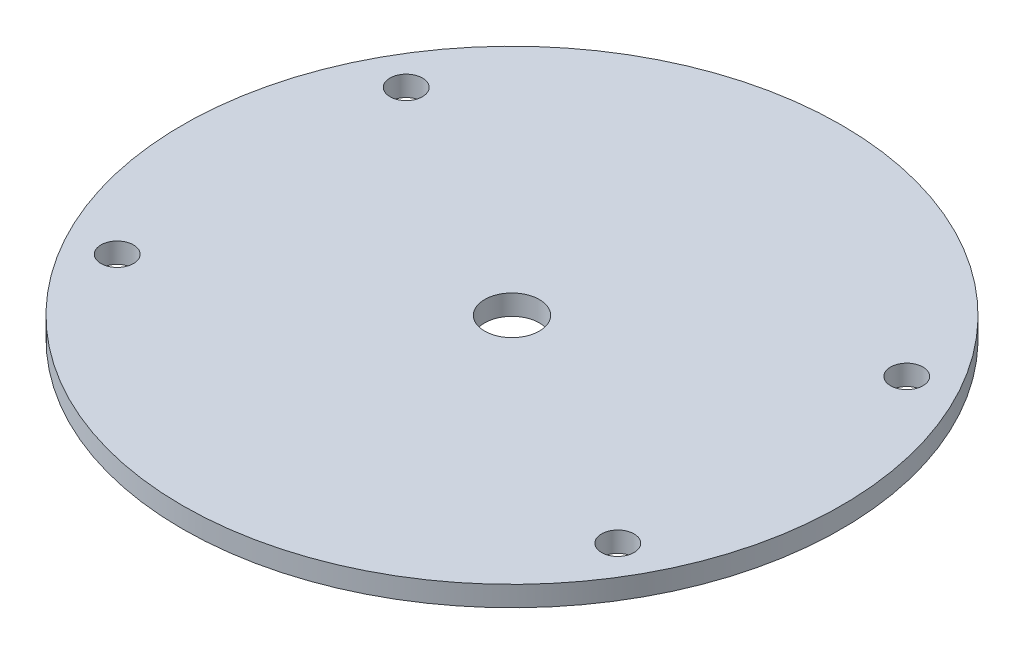
ISO-10303-21;
HEADER;
FILE_DESCRIPTION(('STEP AP214'),'2;1');
FILE_NAME('part.step','',(''),(''),'','','');
FILE_SCHEMA(('AUTOMOTIVE_DESIGN { 1 0 10303 214 1 1 1 1 }'));
ENDSEC;
DATA;
#1=APPLICATION_CONTEXT('core data for automotive mechanical design processes');
#2=APPLICATION_PROTOCOL_DEFINITION('international standard','automotive_design',2000,#1);
#3=PRODUCT_CONTEXT('',#1,'mechanical');
#4=PRODUCT('Part','Part','',(#3));
#5=PRODUCT_RELATED_PRODUCT_CATEGORY('part','',(#4));
#6=PRODUCT_DEFINITION_FORMATION('','',#4);
#7=PRODUCT_DEFINITION_CONTEXT('part definition',#1,'design');
#8=PRODUCT_DEFINITION('design','',#6,#7);
#9=PRODUCT_DEFINITION_SHAPE('','',#8);
#10=(LENGTH_UNIT() NAMED_UNIT(*) SI_UNIT(.MILLI.,.METRE.));
#11=(NAMED_UNIT(*) PLANE_ANGLE_UNIT() SI_UNIT($,.RADIAN.));
#12=(NAMED_UNIT(*) SI_UNIT($,.STERADIAN.) SOLID_ANGLE_UNIT());
#13=UNCERTAINTY_MEASURE_WITH_UNIT(LENGTH_MEASURE(1.E-05),#10,'distance_accuracy_value','');
#14=(GEOMETRIC_REPRESENTATION_CONTEXT(3) GLOBAL_UNCERTAINTY_ASSIGNED_CONTEXT((#13)) GLOBAL_UNIT_ASSIGNED_CONTEXT((#10,
#11,#12)) REPRESENTATION_CONTEXT('',''));
#15=CARTESIAN_POINT('',(0.,0.,0.));
#16=DIRECTION('',(0.,0.,1.));
#17=DIRECTION('',(1.,0.,0.));
#18=AXIS2_PLACEMENT_3D('',#15,#16,#17);
#19=CARTESIAN_POINT('',(0.,2.,0.));
#20=DIRECTION('',(0.,1.,0.));
#21=DIRECTION('',(0.,0.,1.));
#22=AXIS2_PLACEMENT_3D('',#19,#20,#21);
#23=PLANE('',#22);
#24=CARTESIAN_POINT('',(0.,2.,0.));
#25=DIRECTION('',(0.,1.,0.));
#26=DIRECTION('',(0.,0.,1.));
#27=AXIS2_PLACEMENT_3D('',#24,#25,#26);
#28=CIRCLE('',#27,2.7);
#29=CARTESIAN_POINT('',(0.,2.,2.7));
#30=VERTEX_POINT('',#29);
#31=EDGE_CURVE('E63',#30,#30,#28,.T.);
#32=ORIENTED_EDGE('',*,*,#31,.F.);
#33=EDGE_LOOP('',(#32));
#34=FACE_BOUND('',#33,.T.);
#35=CARTESIAN_POINT('',(24.6817240078565,2.,-14.25));
#36=DIRECTION('',(0.,1.,0.));
#37=DIRECTION('',(0.,0.,-1.));
#38=AXIS2_PLACEMENT_3D('',#35,#36,#37);
#39=CIRCLE('',#38,1.6);
#40=CARTESIAN_POINT('',(24.6817240078565,2.,-15.85));
#41=VERTEX_POINT('',#40);
#42=EDGE_CURVE('E51',#41,#41,#39,.T.);
#43=ORIENTED_EDGE('',*,*,#42,.F.);
#44=EDGE_LOOP('',(#43));
#45=FACE_BOUND('',#44,.T.);
#46=CARTESIAN_POINT('',(0.,2.,0.));
#47=DIRECTION('',(0.,1.,0.));
#48=DIRECTION('',(0.,0.,1.));
#49=AXIS2_PLACEMENT_3D('',#46,#47,#48);
#50=CIRCLE('',#49,32.5);
#51=CARTESIAN_POINT('',(0.,2.,32.5));
#52=VERTEX_POINT('',#51);
#53=EDGE_CURVE('E10',#52,#52,#50,.T.);
#54=ORIENTED_EDGE('',*,*,#53,.T.);
#55=EDGE_LOOP('',(#54));
#56=FACE_BOUND('',#55,.T.);
#57=CARTESIAN_POINT('',(-24.6817240078565,2.,14.25));
#58=DIRECTION('',(0.,1.,0.));
#59=DIRECTION('',(0.,0.,-1.));
#60=AXIS2_PLACEMENT_3D('',#57,#58,#59);
#61=CIRCLE('',#60,1.6);
#62=CARTESIAN_POINT('',(-24.6817240078565,2.,12.65));
#63=VERTEX_POINT('',#62);
#64=EDGE_CURVE('E46',#63,#63,#61,.T.);
#65=ORIENTED_EDGE('',*,*,#64,.F.);
#66=EDGE_LOOP('',(#65));
#67=FACE_BOUND('',#66,.T.);
#68=CARTESIAN_POINT('',(-24.6817240078565,2.,-14.25));
#69=DIRECTION('',(0.,1.,0.));
#70=DIRECTION('',(0.,0.,1.));
#71=AXIS2_PLACEMENT_3D('',#68,#69,#70);
#72=CIRCLE('',#71,1.6);
#73=CARTESIAN_POINT('',(-24.6817240078565,2.,-12.65));
#74=VERTEX_POINT('',#73);
#75=EDGE_CURVE('E57',#74,#74,#72,.T.);
#76=ORIENTED_EDGE('',*,*,#75,.F.);
#77=EDGE_LOOP('',(#76));
#78=FACE_BOUND('',#77,.T.);
#79=CARTESIAN_POINT('',(24.6817240078565,2.,14.25));
#80=DIRECTION('',(0.,1.,0.));
#81=DIRECTION('',(0.,0.,1.));
#82=AXIS2_PLACEMENT_3D('',#79,#80,#81);
#83=CIRCLE('',#82,1.6);
#84=CARTESIAN_POINT('',(24.6817240078565,2.,15.85));
#85=VERTEX_POINT('',#84);
#86=EDGE_CURVE('E69',#85,#85,#83,.T.);
#87=ORIENTED_EDGE('',*,*,#86,.F.);
#88=EDGE_LOOP('',(#87));
#89=FACE_BOUND('',#88,.T.);
#90=ADVANCED_FACE('F35',(#34,#45,#56,#67,#78,#89),#23,.T.);
#91=CARTESIAN_POINT('',(0.,0.,0.));
#92=DIRECTION('',(0.,1.,0.));
#93=DIRECTION('',(0.,0.,1.));
#94=AXIS2_PLACEMENT_3D('',#91,#92,#93);
#95=PLANE('',#94);
#96=CARTESIAN_POINT('',(0.,0.,0.));
#97=DIRECTION('',(0.,1.,0.));
#98=DIRECTION('',(0.,0.,1.));
#99=AXIS2_PLACEMENT_3D('',#96,#97,#98);
#100=CIRCLE('',#99,32.5);
#101=CARTESIAN_POINT('',(0.,0.,32.5));
#102=VERTEX_POINT('',#101);
#103=EDGE_CURVE('E39',#102,#102,#100,.T.);
#104=ORIENTED_EDGE('',*,*,#103,.F.);
#105=EDGE_LOOP('',(#104));
#106=FACE_BOUND('',#105,.T.);
#107=CARTESIAN_POINT('',(-24.6817240078565,0.,14.25));
#108=DIRECTION('',(0.,1.,0.));
#109=DIRECTION('',(0.,0.,-1.));
#110=AXIS2_PLACEMENT_3D('',#107,#108,#109);
#111=CIRCLE('',#110,1.6);
#112=CARTESIAN_POINT('',(-24.6817240078565,0.,12.65));
#113=VERTEX_POINT('',#112);
#114=EDGE_CURVE('E48',#113,#113,#111,.T.);
#115=ORIENTED_EDGE('',*,*,#114,.T.);
#116=EDGE_LOOP('',(#115));
#117=FACE_BOUND('',#116,.T.);
#118=CARTESIAN_POINT('',(24.6817240078565,0.,-14.25));
#119=DIRECTION('',(0.,1.,0.));
#120=DIRECTION('',(0.,0.,-1.));
#121=AXIS2_PLACEMENT_3D('',#118,#119,#120);
#122=CIRCLE('',#121,1.6);
#123=CARTESIAN_POINT('',(24.6817240078565,0.,-15.85));
#124=VERTEX_POINT('',#123);
#125=EDGE_CURVE('E54',#124,#124,#122,.T.);
#126=ORIENTED_EDGE('',*,*,#125,.T.);
#127=EDGE_LOOP('',(#126));
#128=FACE_BOUND('',#127,.T.);
#129=CARTESIAN_POINT('',(-24.6817240078565,0.,-14.25));
#130=DIRECTION('',(0.,1.,0.));
#131=DIRECTION('',(0.,0.,1.));
#132=AXIS2_PLACEMENT_3D('',#129,#130,#131);
#133=CIRCLE('',#132,1.6);
#134=CARTESIAN_POINT('',(-24.6817240078565,0.,-12.65));
#135=VERTEX_POINT('',#134);
#136=EDGE_CURVE('E60',#135,#135,#133,.T.);
#137=ORIENTED_EDGE('',*,*,#136,.T.);
#138=EDGE_LOOP('',(#137));
#139=FACE_BOUND('',#138,.T.);
#140=CARTESIAN_POINT('',(0.,0.,0.));
#141=DIRECTION('',(0.,1.,0.));
#142=DIRECTION('',(0.,0.,1.));
#143=AXIS2_PLACEMENT_3D('',#140,#141,#142);
#144=CIRCLE('',#143,2.7);
#145=CARTESIAN_POINT('',(0.,0.,2.7));
#146=VERTEX_POINT('',#145);
#147=EDGE_CURVE('E66',#146,#146,#144,.T.);
#148=ORIENTED_EDGE('',*,*,#147,.T.);
#149=EDGE_LOOP('',(#148));
#150=FACE_BOUND('',#149,.T.);
#151=CARTESIAN_POINT('',(24.6817240078565,0.,14.25));
#152=DIRECTION('',(0.,1.,0.));
#153=DIRECTION('',(0.,0.,1.));
#154=AXIS2_PLACEMENT_3D('',#151,#152,#153);
#155=CIRCLE('',#154,1.6);
#156=CARTESIAN_POINT('',(24.6817240078565,0.,15.85));
#157=VERTEX_POINT('',#156);
#158=EDGE_CURVE('E72',#157,#157,#155,.T.);
#159=ORIENTED_EDGE('',*,*,#158,.T.);
#160=EDGE_LOOP('',(#159));
#161=FACE_BOUND('',#160,.T.);
#162=ADVANCED_FACE('F82',(#106,#117,#128,#139,#150,#161),#95,.F.);
#163=CARTESIAN_POINT('',(0.,2.,0.));
#164=DIRECTION('',(0.,-1.,0.));
#165=DIRECTION('',(0.,0.,-1.));
#166=AXIS2_PLACEMENT_3D('',#163,#164,#165);
#167=CYLINDRICAL_SURFACE('',#166,32.5);
#168=ORIENTED_EDGE('',*,*,#53,.F.);
#169=EDGE_LOOP('',(#168));
#170=FACE_BOUND('',#169,.T.);
#171=ORIENTED_EDGE('',*,*,#103,.T.);
#172=EDGE_LOOP('',(#171));
#173=FACE_BOUND('',#172,.T.);
#174=ADVANCED_FACE('F37',(#170,#173),#167,.T.);
#175=CARTESIAN_POINT('',(-24.6817240078565,2.,14.25));
#176=DIRECTION('',(0.,-1.,0.));
#177=DIRECTION('',(0.,0.,-1.));
#178=AXIS2_PLACEMENT_3D('',#175,#176,#177);
#179=CYLINDRICAL_SURFACE('',#178,1.6);
#180=ORIENTED_EDGE('',*,*,#64,.T.);
#181=EDGE_LOOP('',(#180));
#182=FACE_BOUND('',#181,.T.);
#183=ORIENTED_EDGE('',*,*,#114,.F.);
#184=EDGE_LOOP('',(#183));
#185=FACE_BOUND('',#184,.T.);
#186=ADVANCED_FACE('F92',(#182,#185),#179,.F.);
#187=CARTESIAN_POINT('',(24.6817240078565,2.,-14.25));
#188=DIRECTION('',(0.,-1.,0.));
#189=DIRECTION('',(0.,0.,-1.));
#190=AXIS2_PLACEMENT_3D('',#187,#188,#189);
#191=CYLINDRICAL_SURFACE('',#190,1.6);
#192=ORIENTED_EDGE('',*,*,#42,.T.);
#193=EDGE_LOOP('',(#192));
#194=FACE_BOUND('',#193,.T.);
#195=ORIENTED_EDGE('',*,*,#125,.F.);
#196=EDGE_LOOP('',(#195));
#197=FACE_BOUND('',#196,.T.);
#198=ADVANCED_FACE('F95',(#194,#197),#191,.F.);
#199=CARTESIAN_POINT('',(-24.6817240078565,2.,-14.25));
#200=DIRECTION('',(0.,-1.,0.));
#201=DIRECTION('',(0.,0.,-1.));
#202=AXIS2_PLACEMENT_3D('',#199,#200,#201);
#203=CYLINDRICAL_SURFACE('',#202,1.6);
#204=ORIENTED_EDGE('',*,*,#75,.T.);
#205=EDGE_LOOP('',(#204));
#206=FACE_BOUND('',#205,.T.);
#207=ORIENTED_EDGE('',*,*,#136,.F.);
#208=EDGE_LOOP('',(#207));
#209=FACE_BOUND('',#208,.T.);
#210=ADVANCED_FACE('F99',(#206,#209),#203,.F.);
#211=CARTESIAN_POINT('',(0.,2.,0.));
#212=DIRECTION('',(0.,-1.,0.));
#213=DIRECTION('',(0.,0.,-1.));
#214=AXIS2_PLACEMENT_3D('',#211,#212,#213);
#215=CYLINDRICAL_SURFACE('',#214,2.7);
#216=ORIENTED_EDGE('',*,*,#31,.T.);
#217=EDGE_LOOP('',(#216));
#218=FACE_BOUND('',#217,.T.);
#219=ORIENTED_EDGE('',*,*,#147,.F.);
#220=EDGE_LOOP('',(#219));
#221=FACE_BOUND('',#220,.T.);
#222=ADVANCED_FACE('F103',(#218,#221),#215,.F.);
#223=CARTESIAN_POINT('',(24.6817240078565,2.,14.25));
#224=DIRECTION('',(0.,-1.,0.));
#225=DIRECTION('',(0.,0.,-1.));
#226=AXIS2_PLACEMENT_3D('',#223,#224,#225);
#227=CYLINDRICAL_SURFACE('',#226,1.6);
#228=ORIENTED_EDGE('',*,*,#86,.T.);
#229=EDGE_LOOP('',(#228));
#230=FACE_BOUND('',#229,.T.);
#231=ORIENTED_EDGE('',*,*,#158,.F.);
#232=EDGE_LOOP('',(#231));
#233=FACE_BOUND('',#232,.T.);
#234=ADVANCED_FACE('F78',(#230,#233),#227,.F.);
#235=CLOSED_SHELL('',(#90,#162,#174,#186,#198,#210,#222,#234));
#236=MANIFOLD_SOLID_BREP('B2',#235);
#237=ADVANCED_BREP_SHAPE_REPRESENTATION('',(#18,#236),#14);
#238=SHAPE_DEFINITION_REPRESENTATION(#9,#237);
ENDSEC;
END-ISO-10303-21;
